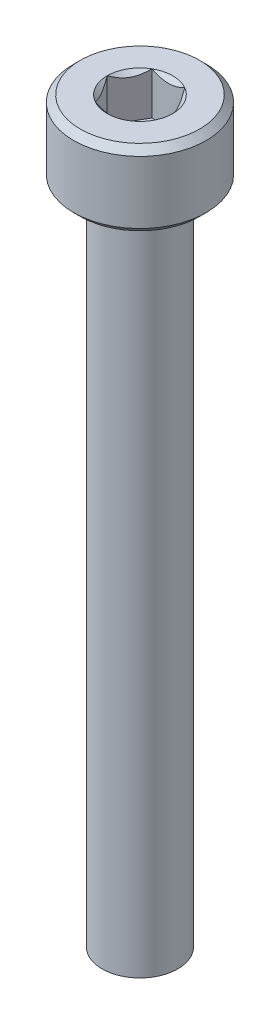
ISO-10303-21;
HEADER;
FILE_DESCRIPTION(('STEP AP214'),'2;1');
FILE_NAME('part.step','',(''),(''),'','','');
FILE_SCHEMA(('AUTOMOTIVE_DESIGN { 1 0 10303 214 1 1 1 1 }'));
ENDSEC;
DATA;
#1=APPLICATION_CONTEXT('core data for automotive mechanical design processes');
#2=APPLICATION_PROTOCOL_DEFINITION('international standard','automotive_design',2000,#1);
#3=PRODUCT_CONTEXT('',#1,'mechanical');
#4=PRODUCT('Part','Part','',(#3));
#5=PRODUCT_RELATED_PRODUCT_CATEGORY('part','',(#4));
#6=PRODUCT_DEFINITION_FORMATION('','',#4);
#7=PRODUCT_DEFINITION_CONTEXT('part definition',#1,'design');
#8=PRODUCT_DEFINITION('design','',#6,#7);
#9=PRODUCT_DEFINITION_SHAPE('','',#8);
#10=(LENGTH_UNIT() NAMED_UNIT(*) SI_UNIT(.MILLI.,.METRE.));
#11=(NAMED_UNIT(*) PLANE_ANGLE_UNIT() SI_UNIT($,.RADIAN.));
#12=(NAMED_UNIT(*) SI_UNIT($,.STERADIAN.) SOLID_ANGLE_UNIT());
#13=UNCERTAINTY_MEASURE_WITH_UNIT(LENGTH_MEASURE(1.E-05),#10,'distance_accuracy_value','');
#14=(GEOMETRIC_REPRESENTATION_CONTEXT(3) GLOBAL_UNCERTAINTY_ASSIGNED_CONTEXT((#13)) GLOBAL_UNIT_ASSIGNED_CONTEXT((#10,
#11,#12)) REPRESENTATION_CONTEXT('',''));
#15=CARTESIAN_POINT('',(0.,0.,0.));
#16=DIRECTION('',(0.,0.,1.));
#17=DIRECTION('',(1.,0.,0.));
#18=AXIS2_PLACEMENT_3D('',#15,#16,#17);
#19=CARTESIAN_POINT('',(0.,4.,0.));
#20=DIRECTION('',(0.,-1.,0.));
#21=DIRECTION('',(0.,0.,-1.));
#22=AXIS2_PLACEMENT_3D('',#19,#20,#21);
#23=CYLINDRICAL_SURFACE('',#22,3.5);
#24=CARTESIAN_POINT('',(0.,0.350000000000001,0.));
#25=DIRECTION('',(0.,1.,0.));
#26=DIRECTION('',(0.,0.,1.));
#27=AXIS2_PLACEMENT_3D('',#24,#25,#26);
#28=CIRCLE('',#27,3.5);
#29=CARTESIAN_POINT('',(0.,0.350000000000001,3.5));
#30=VERTEX_POINT('',#29);
#31=EDGE_CURVE('E227',#30,#30,#28,.T.);
#32=ORIENTED_EDGE('',*,*,#31,.T.);
#33=EDGE_LOOP('',(#32));
#34=FACE_BOUND('',#33,.T.);
#35=CARTESIAN_POINT('',(0.,3.65,0.));
#36=DIRECTION('',(0.,1.,0.));
#37=DIRECTION('',(0.,0.,1.));
#38=AXIS2_PLACEMENT_3D('',#35,#36,#37);
#39=CIRCLE('',#38,3.5);
#40=CARTESIAN_POINT('',(0.,3.65,3.5));
#41=VERTEX_POINT('',#40);
#42=EDGE_CURVE('E104',#41,#41,#39,.F.);
#43=ORIENTED_EDGE('',*,*,#42,.T.);
#44=EDGE_LOOP('',(#43));
#45=FACE_BOUND('',#44,.T.);
#46=ADVANCED_FACE('F32',(#34,#45),#23,.T.);
#47=CARTESIAN_POINT('',(0.,4.,0.));
#48=DIRECTION('',(0.,1.,0.));
#49=DIRECTION('',(0.,0.,1.));
#50=AXIS2_PLACEMENT_3D('',#47,#48,#49);
#51=PLANE('',#50);
#52=CARTESIAN_POINT('',(0.,4.,0.));
#53=DIRECTION('',(0.,1.,0.));
#54=DIRECTION('',(0.,0.,1.));
#55=AXIS2_PLACEMENT_3D('',#52,#53,#54);
#56=CIRCLE('',#55,3.15);
#57=CARTESIAN_POINT('',(0.,4.,3.15));
#58=VERTEX_POINT('',#57);
#59=EDGE_CURVE('E36',#58,#58,#56,.T.);
#60=ORIENTED_EDGE('',*,*,#59,.T.);
#61=EDGE_LOOP('',(#60));
#62=FACE_BOUND('',#61,.T.);
#63=CARTESIAN_POINT('',(0.,4.,0.));
#64=DIRECTION('',(0.,1.,0.));
#65=DIRECTION('',(0.,0.,1.));
#66=AXIS2_PLACEMENT_3D('',#63,#64,#65);
#67=CIRCLE('',#66,1.73205080756888);
#68=CARTESIAN_POINT('',(0.866025403784438,4.,1.5));
#69=VERTEX_POINT('',#68);
#70=CARTESIAN_POINT('',(1.73205080756888,4.,0.));
#71=VERTEX_POINT('',#70);
#72=EDGE_CURVE('E47',#69,#71,#67,.T.);
#73=ORIENTED_EDGE('',*,*,#72,.F.);
#74=CARTESIAN_POINT('',(-0.866025403784438,4.,1.5));
#75=VERTEX_POINT('',#74);
#76=EDGE_CURVE('E54',#75,#69,#67,.T.);
#77=ORIENTED_EDGE('',*,*,#76,.F.);
#78=CARTESIAN_POINT('',(-1.73205080756888,4.,0.));
#79=VERTEX_POINT('',#78);
#80=EDGE_CURVE('E127',#79,#75,#67,.T.);
#81=ORIENTED_EDGE('',*,*,#80,.F.);
#82=CARTESIAN_POINT('',(-0.866025403784439,4.,-1.5));
#83=VERTEX_POINT('',#82);
#84=EDGE_CURVE('E126',#83,#79,#67,.T.);
#85=ORIENTED_EDGE('',*,*,#84,.F.);
#86=CARTESIAN_POINT('',(0.866025403784438,4.,-1.5));
#87=VERTEX_POINT('',#86);
#88=EDGE_CURVE('E94',#87,#83,#67,.T.);
#89=ORIENTED_EDGE('',*,*,#88,.F.);
#90=EDGE_CURVE('E86',#71,#87,#67,.T.);
#91=ORIENTED_EDGE('',*,*,#90,.F.);
#92=EDGE_LOOP('',(#73,#77,#81,#85,#89,#91));
#93=FACE_BOUND('',#92,.T.);
#94=ADVANCED_FACE('F124',(#62,#93),#51,.T.);
#95=CARTESIAN_POINT('',(0.,0.,0.));
#96=DIRECTION('',(0.,1.,0.));
#97=DIRECTION('',(0.,0.,1.));
#98=AXIS2_PLACEMENT_3D('',#95,#96,#97);
#99=PLANE('',#98);
#100=CARTESIAN_POINT('',(0.,0.,0.));
#101=DIRECTION('',(0.,-1.,0.));
#102=DIRECTION('',(0.,0.,-1.));
#103=AXIS2_PLACEMENT_3D('',#100,#101,#102);
#104=CIRCLE('',#103,2.);
#105=CARTESIAN_POINT('',(0.,0.,-2.));
#106=VERTEX_POINT('',#105);
#107=EDGE_CURVE('E11',#106,#106,#104,.T.);
#108=ORIENTED_EDGE('',*,*,#107,.F.);
#109=EDGE_LOOP('',(#108));
#110=FACE_BOUND('',#109,.T.);
#111=CARTESIAN_POINT('',(0.,0.,0.));
#112=DIRECTION('',(0.,1.,0.));
#113=DIRECTION('',(0.,0.,1.));
#114=AXIS2_PLACEMENT_3D('',#111,#112,#113);
#115=CIRCLE('',#114,3.15);
#116=CARTESIAN_POINT('',(0.,0.,3.15));
#117=VERTEX_POINT('',#116);
#118=EDGE_CURVE('E225',#117,#117,#115,.F.);
#119=ORIENTED_EDGE('',*,*,#118,.T.);
#120=EDGE_LOOP('',(#119));
#121=FACE_BOUND('',#120,.T.);
#122=ADVANCED_FACE('F208',(#110,#121),#99,.F.);
#123=CARTESIAN_POINT('',(0.,4.,0.));
#124=DIRECTION('',(0.,1.,0.));
#125=DIRECTION('',(0.,0.,1.));
#126=AXIS2_PLACEMENT_3D('',#123,#124,#125);
#127=CONICAL_SURFACE('',#126,1.73205080756888,0.78539816339745);
#128=ORIENTED_EDGE('',*,*,#88,.T.);
#129=CARTESIAN_POINT('',(-1.72720812969692,4.55557851627079,-1.5));
#130=CARTESIAN_POINT('',(-1.68515175699268,4.52382990785743,-1.5));
#131=CARTESIAN_POINT('',(-1.64286104748673,4.49239259380738,-1.5));
#132=CARTESIAN_POINT('',(-1.55771581035942,4.43026908755641,-1.5));
#133=CARTESIAN_POINT('',(-1.51486114386668,4.3995830858922,-1.5));
#134=CARTESIAN_POINT('',(-1.3846813415127,4.30840719242716,-1.5));
#135=CARTESIAN_POINT('',(-1.29637976071654,4.24928834342677,-1.5));
#136=CARTESIAN_POINT('',(-1.11121478730467,4.1332309963165,-1.5));
#137=CARTESIAN_POINT('',(-1.01415038238167,4.07660955873301,-1.5));
#138=CARTESIAN_POINT('',(-0.815173408897606,3.97303688126565,-1.5));
#139=CARTESIAN_POINT('',(-0.713278669253285,3.92605304154167,-1.5));
#140=CARTESIAN_POINT('',(-0.560333774943112,3.86857266843083,-1.5));
#141=CARTESIAN_POINT('',(-0.511547982948042,3.85207538775725,-1.5));
#142=CARTESIAN_POINT('',(-0.412798620136866,3.822997512927,-1.5));
#143=CARTESIAN_POINT('',(-0.362834968437563,3.81041718859402,-1.5));
#144=CARTESIAN_POINT('',(-0.262863235444982,3.79003619414677,-1.5));
#145=CARTESIAN_POINT('',(-0.212872113808023,3.78215363274598,-1.5));
#146=CARTESIAN_POINT('',(-0.112355243569545,3.771322063969,-1.5));
#147=CARTESIAN_POINT('',(-0.0618295883726279,3.76837220852435,-1.5));
#148=CARTESIAN_POINT('',(0.037429173332384,3.76762485772485,-1.5));
#149=CARTESIAN_POINT('',(0.0861609672002989,3.76964473355808,-1.5));
#150=CARTESIAN_POINT('',(0.183206937768827,3.77832255289676,-1.5));
#151=CARTESIAN_POINT('',(0.231521073438269,3.78498094696846,-1.5));
#152=CARTESIAN_POINT('',(0.328199853425436,3.80268524412257,-1.5));
#153=CARTESIAN_POINT('',(0.376550616310328,3.81380581125704,-1.5));
#154=CARTESIAN_POINT('',(0.472195697125598,3.83984341404871,-1.5));
#155=CARTESIAN_POINT('',(0.51949010309274,3.85476013204094,-1.5));
#156=CARTESIAN_POINT('',(0.668391282696624,3.90733522359607,-1.5));
#157=CARTESIAN_POINT('',(0.767878709508552,3.95098128747198,-1.5));
#158=CARTESIAN_POINT('',(0.962179866690724,4.0480229945931,-1.5));
#159=CARTESIAN_POINT('',(1.05697519961444,4.10145366508953,-1.5));
#160=CARTESIAN_POINT('',(1.23814273533383,4.21168585200456,-1.5));
#161=CARTESIAN_POINT('',(1.3246994218129,4.2681879206986,-1.5));
#162=CARTESIAN_POINT('',(1.45222331290673,4.35553430157866,-1.5));
#163=CARTESIAN_POINT('',(1.49418091978756,4.38495775868004,-1.5));
#164=CARTESIAN_POINT('',(1.57752272931476,4.44458282183046,-1.5));
#165=CARTESIAN_POINT('',(1.61890708647354,4.47478421166444,-1.5));
#166=CARTESIAN_POINT('',(1.66005278019494,4.50530817860946,-1.5));
#167=B_SPLINE_CURVE_WITH_KNOTS('',3,(#129,#130,#131,#132,#133,#134,#135,#136,#137,#138,#139,
#140,#141,#142,#143,#144,#145,#146,#147,#148,#149,#150,#151,#152,#153,#154,#155,#156,#157,#158,
#159,#160,#161,#162,#163,#164,#165,#166),.UNSPECIFIED.,.F.,.F.,(4,2,2,2,2,2,2,2,2,2,2,2,2,2,2,2,
2,2,4),(0.,0.158079548982669,0.316198780993942,0.634850417346958,0.971690311361509,
1.30737131660667,1.46173961127089,1.61611853740677,1.76772101421409,1.91929742368538,
2.065387412096,2.21149159305544,2.36014984633872,2.50879566386709,2.83376031422673,
3.15991186985652,3.46985601802197,3.62358896039974,3.7772796264207),.UNSPECIFIED.);
#168=EDGE_CURVE('E99',#87,#83,#167,.F.);
#169=ORIENTED_EDGE('',*,*,#168,.F.);
#170=EDGE_LOOP('',(#128,#169));
#171=FACE_BOUND('',#170,.T.);
#172=ADVANCED_FACE('F100',(#171),#127,.F.);
#173=ORIENTED_EDGE('',*,*,#84,.T.);
#174=CARTESIAN_POINT('',(-0.865909933730601,4.00011548160007,-1.5002));
#175=CARTESIAN_POINT('',(-0.895682611594166,3.97036547606733,-1.44863220926292));
#176=CARTESIAN_POINT('',(-0.925953159489765,3.94236248391031,-1.3962020823348));
#177=CARTESIAN_POINT('',(-0.987678321317123,3.89108923044014,-1.2892909659444));
#178=CARTESIAN_POINT('',(-1.01913880822717,3.86784750504437,-1.23479980418534));
#179=CARTESIAN_POINT('',(-1.08257741237344,3.82803372899222,-1.12492091864275));
#180=CARTESIAN_POINT('',(-1.11453936608521,3.8113615856709,-1.0695611909048));
#181=CARTESIAN_POINT('',(-1.1791670593912,3.7856744568181,-0.957622742522849));
#182=CARTESIAN_POINT('',(-1.21183082354213,3.77664029047887,-0.901047443446992));
#183=CARTESIAN_POINT('',(-1.26812411040032,3.76848908122685,-0.803544610483559));
#184=CARTESIAN_POINT('',(-1.29168087824208,3.76728225298922,-0.762743091719534));
#185=CARTESIAN_POINT('',(-1.33875285845138,3.76931405716227,-0.681212030384142));
#186=CARTESIAN_POINT('',(-1.36226806050018,3.77255367074831,-0.64048250568537));
#187=CARTESIAN_POINT('',(-1.40907206156905,3.78329198598196,-0.559415597836584));
#188=CARTESIAN_POINT('',(-1.43236062923612,3.79079465301873,-0.519078615401712));
#189=CARTESIAN_POINT('',(-1.47854689118996,3.80965161192829,-0.439081663085969));
#190=CARTESIAN_POINT('',(-1.50144441326545,3.82100755701858,-0.399421991483792));
#191=CARTESIAN_POINT('',(-1.56009461325633,3.85472164759267,-0.297836865225515));
#192=CARTESIAN_POINT('',(-1.59548353987866,3.87962184909337,-0.236541446290311));
#193=CARTESIAN_POINT('',(-1.64751843074894,3.92165665327158,-0.146414371536686));
#194=CARTESIAN_POINT('',(-1.66466545167617,3.9364251535591,-0.116714860092282));
#195=CARTESIAN_POINT('',(-1.69864410935691,3.96731056594017,-0.0578620986162487));
#196=CARTESIAN_POINT('',(-1.71547589206761,3.98342683412171,-0.0287085957793624));
#197=CARTESIAN_POINT('',(-1.73216627762272,4.00011548160007,0.00020000000000028));
#198=B_SPLINE_CURVE_WITH_KNOTS('',3,(#174,#175,#176,#177,#178,#179,#180,#181,#182,#183,#184,
#185,#186,#187,#188,#189,#190,#191,#192,#193,#194,#195,#196,#197),.UNSPECIFIED.,.F.,.F.,(4,2,2,
2,2,2,2,2,2,2,2,4),(0.,0.199829143693304,0.400822987382388,0.598623720538181,0.795926240188889,
0.937113067959881,1.07833105577193,1.21968061668222,1.36109089931054,1.58570969637565,
1.69770705470964,1.80965120737194),.UNSPECIFIED.);
#199=EDGE_CURVE('E129',#83,#79,#198,.T.);
#200=ORIENTED_EDGE('',*,*,#199,.F.);
#201=EDGE_LOOP('',(#173,#200));
#202=FACE_BOUND('',#201,.T.);
#203=ADVANCED_FACE('F240',(#202),#127,.F.);
#204=ORIENTED_EDGE('',*,*,#80,.T.);
#205=CARTESIAN_POINT('',(-1.73216627762272,4.00011548160007,-0.000199999999999694));
#206=CARTESIAN_POINT('',(-1.70239359975915,3.97036547606733,0.051367790737076));
#207=CARTESIAN_POINT('',(-1.67212305186355,3.94236248391031,0.103797917665201));
#208=CARTESIAN_POINT('',(-1.61039789003619,3.89108923044014,0.210709034055597));
#209=CARTESIAN_POINT('',(-1.57893740312614,3.86784750504437,0.265200195814662));
#210=CARTESIAN_POINT('',(-1.51549879897987,3.82803372899222,0.375079081357249));
#211=CARTESIAN_POINT('',(-1.4835368452681,3.8113615856709,0.4304388090952));
#212=CARTESIAN_POINT('',(-1.41890915196211,3.7856744568181,0.542377257477151));
#213=CARTESIAN_POINT('',(-1.38624538781118,3.77664029047887,0.598952556553009));
#214=CARTESIAN_POINT('',(-1.32995210095299,3.76848908122685,0.696455389516441));
#215=CARTESIAN_POINT('',(-1.30639533311124,3.76728225298922,0.737256908280466));
#216=CARTESIAN_POINT('',(-1.25932335290193,3.76931405716227,0.818787969615858));
#217=CARTESIAN_POINT('',(-1.23580815085313,3.77255367074831,0.85951749431463));
#218=CARTESIAN_POINT('',(-1.18900414978427,3.78329198598196,0.940584402163416));
#219=CARTESIAN_POINT('',(-1.1657155821172,3.79079465301873,0.980921384598288));
#220=CARTESIAN_POINT('',(-1.11952932016335,3.80965161192829,1.06091833691403));
#221=CARTESIAN_POINT('',(-1.09663179808786,3.82100755701859,1.10057800851621));
#222=CARTESIAN_POINT('',(-1.03798159809698,3.85472164759267,1.20216313477448));
#223=CARTESIAN_POINT('',(-1.00259267147465,3.87962184909337,1.26345855370969));
#224=CARTESIAN_POINT('',(-0.950557780604375,3.92165665327158,1.35358562846331));
#225=CARTESIAN_POINT('',(-0.933410759677147,3.9364251535591,1.38328513990772));
#226=CARTESIAN_POINT('',(-0.899432101996407,3.96731056594017,1.44213790138375));
#227=CARTESIAN_POINT('',(-0.88260031928571,3.98342683412171,1.47129140422064));
#228=CARTESIAN_POINT('',(-0.865909933730601,4.00011548160007,1.5002));
#229=B_SPLINE_CURVE_WITH_KNOTS('',3,(#205,#206,#207,#208,#209,#210,#211,#212,#213,#214,#215,
#216,#217,#218,#219,#220,#221,#222,#223,#224,#225,#226,#227,#228),.UNSPECIFIED.,.F.,.F.,(4,2,2,
2,2,2,2,2,2,2,2,4),(0.,0.199829143693305,0.400822987382389,0.598623720538181,0.795926240188889,
0.937113067959881,1.07833105577193,1.21968061668222,1.36109089931054,1.58570969637565,
1.69770705470964,1.80965120737194),.UNSPECIFIED.);
#230=EDGE_CURVE('E139',#79,#75,#229,.T.);
#231=ORIENTED_EDGE('',*,*,#230,.F.);
#232=EDGE_LOOP('',(#204,#231));
#233=FACE_BOUND('',#232,.T.);
#234=ADVANCED_FACE('F256',(#233),#127,.F.);
#235=ORIENTED_EDGE('',*,*,#76,.T.);
#236=CARTESIAN_POINT('',(-1.72720812994822,4.55557851646053,1.5));
#237=CARTESIAN_POINT('',(-1.68515175723693,4.52382990803985,1.5));
#238=CARTESIAN_POINT('',(-1.64286104772391,4.49239259398251,1.5));
#239=CARTESIAN_POINT('',(-1.55771581058238,4.43026908771699,1.5));
#240=CARTESIAN_POINT('',(-1.51486114408249,4.39958308604553,1.5));
#241=CARTESIAN_POINT('',(-1.38468134170665,4.30840719255859,1.5));
#242=CARTESIAN_POINT('',(-1.29637976089561,4.24928834354366,1.5));
#243=CARTESIAN_POINT('',(-1.11121478745132,4.13323099640349,1.5));
#244=CARTESIAN_POINT('',(-1.01415038251067,4.07660955880473,1.5));
#245=CARTESIAN_POINT('',(-0.815173408989814,3.9730368813091,1.5));
#246=CARTESIAN_POINT('',(-0.71327866932636,3.92605304157206,1.5));
#247=CARTESIAN_POINT('',(-0.56033377500179,3.86857266845154,1.5));
#248=CARTESIAN_POINT('',(-0.511547983012749,3.85207538777834,1.5));
#249=CARTESIAN_POINT('',(-0.412798620213828,3.82299751294763,1.5));
#250=CARTESIAN_POINT('',(-0.362834968520751,3.8104171886138,1.5));
#251=CARTESIAN_POINT('',(-0.262863235540417,3.79003619416346,1.5));
#252=CARTESIAN_POINT('',(-0.212872113909475,3.78215363276045,1.5));
#253=CARTESIAN_POINT('',(-0.112355243682832,3.77132206397768,1.5));
#254=CARTESIAN_POINT('',(-0.061829588491731,3.76837220852945,1.5));
#255=CARTESIAN_POINT('',(0.0374291732025493,3.76762485772178,1.5));
#256=CARTESIAN_POINT('',(0.086160967065534,3.76964473355048,1.5));
#257=CARTESIAN_POINT('',(0.183206937624695,3.77832255287941,1.5));
#258=CARTESIAN_POINT('',(0.2315210732897,3.78498094694588,1.5));
#259=CARTESIAN_POINT('',(0.328199853268108,3.80268524408904,1.5));
#260=CARTESIAN_POINT('',(0.376550616148692,3.81380581121775,1.5));
#261=CARTESIAN_POINT('',(0.47219569695576,3.83984341399777,1.5));
#262=CARTESIAN_POINT('',(0.51949010291901,3.8547601319841,1.5));
#263=CARTESIAN_POINT('',(0.668391282485064,3.90733522351148,1.5));
#264=CARTESIAN_POINT('',(0.767878709264951,3.95098128736184,1.5));
#265=CARTESIAN_POINT('',(0.9621798663855,4.04802299442906,1.5));
#266=CARTESIAN_POINT('',(1.05697519927965,4.10145366489712,1.5));
#267=CARTESIAN_POINT('',(1.23814273494588,4.21168585175783,1.5));
#268=CARTESIAN_POINT('',(1.32469942140117,4.26818792042618,1.5));
#269=CARTESIAN_POINT('',(1.45222331245985,4.35553430126784,1.5));
#270=CARTESIAN_POINT('',(1.49418091932912,4.38495775835653,1.5));
#271=CARTESIAN_POINT('',(1.5775227288333,4.44458282148157,1.5));
#272=CARTESIAN_POINT('',(1.6189070859806,4.47478421130286,1.5));
#273=CARTESIAN_POINT('',(1.66005277969054,4.50530817823521,1.5));
#274=B_SPLINE_CURVE_WITH_KNOTS('',3,(#236,#237,#238,#239,#240,#241,#242,#243,#244,#245,#246,
#247,#248,#249,#250,#251,#252,#253,#254,#255,#256,#257,#258,#259,#260,#261,#262,#263,#264,#265,
#266,#267,#268,#269,#270,#271,#272,#273),.UNSPECIFIED.,.F.,.F.,(4,2,2,2,2,2,2,2,2,2,2,2,2,2,2,2,
2,2,4),(0.,0.158079549012757,0.316198781054129,0.634850417468465,0.971690311551782,
1.30737131686505,1.46173961151184,1.61611853763032,1.76772101442095,1.91929742387554,
2.06538741227089,2.21149159321503,2.36014984648185,2.50879566399376,2.83376031423511,
3.15991186974582,3.4698560178094,3.62358896013692,3.77727962610764),.UNSPECIFIED.);
#275=EDGE_CURVE('E168',#75,#69,#274,.T.);
#276=ORIENTED_EDGE('',*,*,#275,.F.);
#277=EDGE_LOOP('',(#235,#276));
#278=FACE_BOUND('',#277,.T.);
#279=ADVANCED_FACE('F286',(#278),#127,.F.);
#280=ORIENTED_EDGE('',*,*,#72,.T.);
#281=CARTESIAN_POINT('',(0.865909933730601,4.00011548160007,1.5002));
#282=CARTESIAN_POINT('',(0.895682611594166,3.97036547606733,1.44863220926292));
#283=CARTESIAN_POINT('',(0.925953159489765,3.94236248391031,1.3962020823348));
#284=CARTESIAN_POINT('',(0.987678321317124,3.89108923044014,1.2892909659444));
#285=CARTESIAN_POINT('',(1.01913880822717,3.86784750504437,1.23479980418534));
#286=CARTESIAN_POINT('',(1.08257741237344,3.82803372899222,1.12492091864275));
#287=CARTESIAN_POINT('',(1.11453936608521,3.8113615856709,1.0695611909048));
#288=CARTESIAN_POINT('',(1.1791670593912,3.7856744568181,0.95762274252285));
#289=CARTESIAN_POINT('',(1.21183082354213,3.77664029047887,0.901047443446992));
#290=CARTESIAN_POINT('',(1.26812411040032,3.76848908122685,0.80354461048356));
#291=CARTESIAN_POINT('',(1.29168087824208,3.76728225298922,0.762743091719534));
#292=CARTESIAN_POINT('',(1.33875285845138,3.76931405716227,0.681212030384142));
#293=CARTESIAN_POINT('',(1.36226806050018,3.77255367074831,0.640482505685371));
#294=CARTESIAN_POINT('',(1.40907206156905,3.78329198598196,0.559415597836584));
#295=CARTESIAN_POINT('',(1.43236062923612,3.79079465301873,0.519078615401712));
#296=CARTESIAN_POINT('',(1.47854689118996,3.80965161192829,0.43908166308597));
#297=CARTESIAN_POINT('',(1.50144441326545,3.82100755701859,0.399421991483792));
#298=CARTESIAN_POINT('',(1.56009461325633,3.85472164759267,0.297836865225515));
#299=CARTESIAN_POINT('',(1.59548353987866,3.87962184909337,0.236541446290311));
#300=CARTESIAN_POINT('',(1.64751843074894,3.92165665327158,0.146414371536686));
#301=CARTESIAN_POINT('',(1.66466545167617,3.9364251535591,0.116714860092282));
#302=CARTESIAN_POINT('',(1.69864410935691,3.96731056594017,0.0578620986162488));
#303=CARTESIAN_POINT('',(1.71547589206761,3.98342683412171,0.0287085957793626));
#304=CARTESIAN_POINT('',(1.73216627762272,4.00011548160007,-0.000200000000000026));
#305=B_SPLINE_CURVE_WITH_KNOTS('',3,(#281,#282,#283,#284,#285,#286,#287,#288,#289,#290,#291,
#292,#293,#294,#295,#296,#297,#298,#299,#300,#301,#302,#303,#304),.UNSPECIFIED.,.F.,.F.,(4,2,2,
2,2,2,2,2,2,2,2,4),(0.,0.199829143693305,0.400822987382389,0.59862372053818,0.795926240188889,
0.937113067959881,1.07833105577193,1.21968061668222,1.36109089931054,1.58570969637565,
1.69770705470964,1.80965120737194),.UNSPECIFIED.);
#306=EDGE_CURVE('E114',#69,#71,#305,.T.);
#307=ORIENTED_EDGE('',*,*,#306,.F.);
#308=EDGE_LOOP('',(#280,#307));
#309=FACE_BOUND('',#308,.T.);
#310=ADVANCED_FACE('F154',(#309),#127,.F.);
#311=ORIENTED_EDGE('',*,*,#90,.T.);
#312=CARTESIAN_POINT('',(1.73216627762272,4.00011548160007,0.000200000000000282));
#313=CARTESIAN_POINT('',(1.70239359975915,3.97036547606733,-0.0513677907370753));
#314=CARTESIAN_POINT('',(1.67212305186355,3.94236248391031,-0.103797917665201));
#315=CARTESIAN_POINT('',(1.61039789003619,3.89108923044014,-0.210709034055596));
#316=CARTESIAN_POINT('',(1.57893740312614,3.86784750504437,-0.265200195814661));
#317=CARTESIAN_POINT('',(1.51549879897987,3.82803372899222,-0.375079081357248));
#318=CARTESIAN_POINT('',(1.4835368452681,3.8113615856709,-0.430438809095199));
#319=CARTESIAN_POINT('',(1.41890915196211,3.7856744568181,-0.54237725747715));
#320=CARTESIAN_POINT('',(1.38624538781118,3.77664029047887,-0.598952556553008));
#321=CARTESIAN_POINT('',(1.32995210095299,3.76848908122685,-0.69645538951644));
#322=CARTESIAN_POINT('',(1.30639533311124,3.76728225298922,-0.737256908280466));
#323=CARTESIAN_POINT('',(1.25932335290193,3.76931405716227,-0.818787969615858));
#324=CARTESIAN_POINT('',(1.23580815085313,3.77255367074831,-0.85951749431463));
#325=CARTESIAN_POINT('',(1.18900414978427,3.78329198598196,-0.940584402163416));
#326=CARTESIAN_POINT('',(1.1657155821172,3.79079465301873,-0.980921384598288));
#327=CARTESIAN_POINT('',(1.11952932016335,3.80965161192829,-1.06091833691403));
#328=CARTESIAN_POINT('',(1.09663179808786,3.82100755701858,-1.10057800851621));
#329=CARTESIAN_POINT('',(1.03798159809698,3.85472164759267,-1.20216313477448));
#330=CARTESIAN_POINT('',(1.00259267147465,3.87962184909337,-1.26345855370969));
#331=CARTESIAN_POINT('',(0.950557780604375,3.92165665327158,-1.35358562846331));
#332=CARTESIAN_POINT('',(0.933410759677148,3.9364251535591,-1.38328513990772));
#333=CARTESIAN_POINT('',(0.899432101996407,3.96731056594017,-1.44213790138375));
#334=CARTESIAN_POINT('',(0.88260031928571,3.98342683412171,-1.47129140422064));
#335=CARTESIAN_POINT('',(0.865909933730601,4.00011548160007,-1.5002));
#336=B_SPLINE_CURVE_WITH_KNOTS('',3,(#312,#313,#314,#315,#316,#317,#318,#319,#320,#321,#322,
#323,#324,#325,#326,#327,#328,#329,#330,#331,#332,#333,#334,#335),.UNSPECIFIED.,.F.,.F.,(4,2,2,
2,2,2,2,2,2,2,2,4),(0.,0.199829143693305,0.400822987382389,0.598623720538181,0.79592624018889,
0.937113067959881,1.07833105577193,1.21968061668222,1.36109089931054,1.58570969637566,
1.69770705470964,1.80965120737194),.UNSPECIFIED.);
#337=EDGE_CURVE('E90',#71,#87,#336,.T.);
#338=ORIENTED_EDGE('',*,*,#337,.F.);
#339=EDGE_LOOP('',(#311,#338));
#340=FACE_BOUND('',#339,.T.);
#341=ADVANCED_FACE('F88',(#340),#127,.F.);
#342=CARTESIAN_POINT('',(0.,1.75,0.));
#343=DIRECTION('',(0.,1.,0.));
#344=DIRECTION('',(0.,0.,1.));
#345=AXIS2_PLACEMENT_3D('',#342,#343,#344);
#346=PLANE('',#345);
#347=DIRECTION('',(-0.5,0.,-0.866025403784439));
#348=VECTOR('',#347,1.);
#349=CARTESIAN_POINT('',(1.73205080756888,1.75,0.));
#350=LINE('',#349,#348);
#351=CARTESIAN_POINT('',(1.73205080756888,1.75,0.));
#352=VERTEX_POINT('',#351);
#353=CARTESIAN_POINT('',(0.866025403784438,1.75,-1.5));
#354=VERTEX_POINT('',#353);
#355=EDGE_CURVE('E113',#352,#354,#350,.T.);
#356=ORIENTED_EDGE('',*,*,#355,.T.);
#357=DIRECTION('',(-1.,0.,0.));
#358=VECTOR('',#357,1.);
#359=CARTESIAN_POINT('',(0.866025403784438,1.75,-1.5));
#360=LINE('',#359,#358);
#361=CARTESIAN_POINT('',(-0.866025403784439,1.75,-1.5));
#362=VERTEX_POINT('',#361);
#363=EDGE_CURVE('E118',#354,#362,#360,.T.);
#364=ORIENTED_EDGE('',*,*,#363,.T.);
#365=DIRECTION('',(-0.5,0.,0.866025403784439));
#366=VECTOR('',#365,1.);
#367=CARTESIAN_POINT('',(-0.866025403784439,1.75,-1.5));
#368=LINE('',#367,#366);
#369=CARTESIAN_POINT('',(-1.73205080756888,1.75,0.));
#370=VERTEX_POINT('',#369);
#371=EDGE_CURVE('E280',#362,#370,#368,.T.);
#372=ORIENTED_EDGE('',*,*,#371,.T.);
#373=DIRECTION('',(0.5,0.,0.866025403784439));
#374=VECTOR('',#373,1.);
#375=CARTESIAN_POINT('',(-1.73205080756888,1.75,0.));
#376=LINE('',#375,#374);
#377=CARTESIAN_POINT('',(-0.866025403784438,1.75,1.5));
#378=VERTEX_POINT('',#377);
#379=EDGE_CURVE('E263',#370,#378,#376,.T.);
#380=ORIENTED_EDGE('',*,*,#379,.T.);
#381=DIRECTION('',(1.,0.,0.));
#382=VECTOR('',#381,1.);
#383=CARTESIAN_POINT('',(-0.866025403784438,1.75,1.5));
#384=LINE('',#383,#382);
#385=CARTESIAN_POINT('',(0.866025403784439,1.75,1.5));
#386=VERTEX_POINT('',#385);
#387=EDGE_CURVE('E276',#378,#386,#384,.T.);
#388=ORIENTED_EDGE('',*,*,#387,.T.);
#389=DIRECTION('',(0.5,0.,-0.866025403784439));
#390=VECTOR('',#389,1.);
#391=CARTESIAN_POINT('',(0.866025403784439,1.75,1.5));
#392=LINE('',#391,#390);
#393=EDGE_CURVE('E121',#386,#352,#392,.T.);
#394=ORIENTED_EDGE('',*,*,#393,.T.);
#395=EDGE_LOOP('',(#356,#364,#372,#380,#388,#394));
#396=FACE_BOUND('',#395,.T.);
#397=ADVANCED_FACE('F153',(#396),#346,.T.);
#398=CARTESIAN_POINT('',(0.866025403784438,1.75,-1.5));
#399=DIRECTION('',(0.,0.,-1.));
#400=DIRECTION('',(-1.,0.,0.));
#401=AXIS2_PLACEMENT_3D('',#398,#399,#400);
#402=PLANE('',#401);
#403=DIRECTION('',(0.,1.,0.));
#404=VECTOR('',#403,1.);
#405=CARTESIAN_POINT('',(0.866025403784438,1.75,-1.5));
#406=LINE('',#405,#404);
#407=EDGE_CURVE('E111',#354,#87,#406,.T.);
#408=ORIENTED_EDGE('',*,*,#407,.T.);
#409=ORIENTED_EDGE('',*,*,#168,.T.);
#410=DIRECTION('',(0.,1.,0.));
#411=VECTOR('',#410,1.);
#412=CARTESIAN_POINT('',(-0.866025403784439,1.75,-1.5));
#413=LINE('',#412,#411);
#414=EDGE_CURVE('E120',#362,#83,#413,.T.);
#415=ORIENTED_EDGE('',*,*,#414,.F.);
#416=ORIENTED_EDGE('',*,*,#363,.F.);
#417=EDGE_LOOP('',(#408,#409,#415,#416));
#418=FACE_BOUND('',#417,.T.);
#419=ADVANCED_FACE('F116',(#418),#402,.F.);
#420=CARTESIAN_POINT('',(-0.866025403784439,1.75,-1.5));
#421=DIRECTION('',(-0.866025403784439,0.,-0.5));
#422=DIRECTION('',(-0.5,0.,0.866025403784439));
#423=AXIS2_PLACEMENT_3D('',#420,#421,#422);
#424=PLANE('',#423);
#425=ORIENTED_EDGE('',*,*,#414,.T.);
#426=ORIENTED_EDGE('',*,*,#199,.T.);
#427=DIRECTION('',(0.,1.,0.));
#428=VECTOR('',#427,1.);
#429=CARTESIAN_POINT('',(-1.73205080756888,1.75,0.));
#430=LINE('',#429,#428);
#431=EDGE_CURVE('E259',#370,#79,#430,.T.);
#432=ORIENTED_EDGE('',*,*,#431,.F.);
#433=ORIENTED_EDGE('',*,*,#371,.F.);
#434=EDGE_LOOP('',(#425,#426,#432,#433));
#435=FACE_BOUND('',#434,.T.);
#436=ADVANCED_FACE('F146',(#435),#424,.F.);
#437=CARTESIAN_POINT('',(-1.73205080756888,1.75,0.));
#438=DIRECTION('',(-0.866025403784439,0.,0.5));
#439=DIRECTION('',(0.5,0.,0.866025403784439));
#440=AXIS2_PLACEMENT_3D('',#437,#438,#439);
#441=PLANE('',#440);
#442=ORIENTED_EDGE('',*,*,#431,.T.);
#443=ORIENTED_EDGE('',*,*,#230,.T.);
#444=DIRECTION('',(0.,1.,0.));
#445=VECTOR('',#444,1.);
#446=CARTESIAN_POINT('',(-0.866025403784438,1.75,1.5));
#447=LINE('',#446,#445);
#448=EDGE_CURVE('E265',#378,#75,#447,.T.);
#449=ORIENTED_EDGE('',*,*,#448,.F.);
#450=ORIENTED_EDGE('',*,*,#379,.F.);
#451=EDGE_LOOP('',(#442,#443,#449,#450));
#452=FACE_BOUND('',#451,.T.);
#453=ADVANCED_FACE('F192',(#452),#441,.F.);
#454=CARTESIAN_POINT('',(-0.866025403784438,1.75,1.5));
#455=DIRECTION('',(0.,0.,1.));
#456=DIRECTION('',(1.,0.,0.));
#457=AXIS2_PLACEMENT_3D('',#454,#455,#456);
#458=PLANE('',#457);
#459=ORIENTED_EDGE('',*,*,#448,.T.);
#460=ORIENTED_EDGE('',*,*,#275,.T.);
#461=DIRECTION('',(0.,1.,0.));
#462=VECTOR('',#461,1.);
#463=CARTESIAN_POINT('',(0.866025403784439,1.75,1.5));
#464=LINE('',#463,#462);
#465=EDGE_CURVE('E267',#386,#69,#464,.T.);
#466=ORIENTED_EDGE('',*,*,#465,.F.);
#467=ORIENTED_EDGE('',*,*,#387,.F.);
#468=EDGE_LOOP('',(#459,#460,#466,#467));
#469=FACE_BOUND('',#468,.T.);
#470=ADVANCED_FACE('F188',(#469),#458,.F.);
#471=CARTESIAN_POINT('',(0.866025403784439,1.75,1.5));
#472=DIRECTION('',(0.866025403784439,0.,0.5));
#473=DIRECTION('',(0.5,0.,-0.866025403784439));
#474=AXIS2_PLACEMENT_3D('',#471,#472,#473);
#475=PLANE('',#474);
#476=ORIENTED_EDGE('',*,*,#465,.T.);
#477=ORIENTED_EDGE('',*,*,#306,.T.);
#478=DIRECTION('',(0.,1.,0.));
#479=VECTOR('',#478,1.);
#480=CARTESIAN_POINT('',(1.73205080756888,1.75,0.));
#481=LINE('',#480,#479);
#482=EDGE_CURVE('E105',#352,#71,#481,.T.);
#483=ORIENTED_EDGE('',*,*,#482,.F.);
#484=ORIENTED_EDGE('',*,*,#393,.F.);
#485=EDGE_LOOP('',(#476,#477,#483,#484));
#486=FACE_BOUND('',#485,.T.);
#487=ADVANCED_FACE('F185',(#486),#475,.F.);
#488=CARTESIAN_POINT('',(1.73205080756888,1.75,0.));
#489=DIRECTION('',(0.866025403784439,0.,-0.5));
#490=DIRECTION('',(-0.5,0.,-0.866025403784439));
#491=AXIS2_PLACEMENT_3D('',#488,#489,#490);
#492=PLANE('',#491);
#493=ORIENTED_EDGE('',*,*,#482,.T.);
#494=ORIENTED_EDGE('',*,*,#337,.T.);
#495=ORIENTED_EDGE('',*,*,#407,.F.);
#496=ORIENTED_EDGE('',*,*,#355,.F.);
#497=EDGE_LOOP('',(#493,#494,#495,#496));
#498=FACE_BOUND('',#497,.T.);
#499=ADVANCED_FACE('F109',(#498),#492,.F.);
#500=CARTESIAN_POINT('',(0.,0.350000000000001,0.));
#501=DIRECTION('',(0.,1.,0.));
#502=DIRECTION('',(0.,0.,1.));
#503=AXIS2_PLACEMENT_3D('',#500,#501,#502);
#504=CONICAL_SURFACE('',#503,3.5,0.78539816339745);
#505=ORIENTED_EDGE('',*,*,#118,.F.);
#506=EDGE_LOOP('',(#505));
#507=FACE_BOUND('',#506,.T.);
#508=ORIENTED_EDGE('',*,*,#31,.F.);
#509=EDGE_LOOP('',(#508));
#510=FACE_BOUND('',#509,.T.);
#511=ADVANCED_FACE('F214',(#507,#510),#504,.T.);
#512=CARTESIAN_POINT('',(0.,4.,0.));
#513=DIRECTION('',(0.,-1.,0.));
#514=DIRECTION('',(0.,0.,-1.));
#515=AXIS2_PLACEMENT_3D('',#512,#513,#514);
#516=CONICAL_SURFACE('',#515,3.15,0.785398163397448);
#517=ORIENTED_EDGE('',*,*,#42,.F.);
#518=EDGE_LOOP('',(#517));
#519=FACE_BOUND('',#518,.T.);
#520=ORIENTED_EDGE('',*,*,#59,.F.);
#521=EDGE_LOOP('',(#520));
#522=FACE_BOUND('',#521,.T.);
#523=ADVANCED_FACE('F34',(#519,#522),#516,.T.);
#524=CARTESIAN_POINT('',(0.,-35.,0.));
#525=DIRECTION('',(0.,1.,0.));
#526=DIRECTION('',(0.,0.,1.));
#527=AXIS2_PLACEMENT_3D('',#524,#525,#526);
#528=CYLINDRICAL_SURFACE('',#527,2.);
#529=CARTESIAN_POINT('',(0.,-35.,0.));
#530=DIRECTION('',(0.,-1.,0.));
#531=DIRECTION('',(0.,0.,-1.));
#532=AXIS2_PLACEMENT_3D('',#529,#530,#531);
#533=CIRCLE('',#532,2.);
#534=CARTESIAN_POINT('',(0.,-35.,-2.));
#535=VERTEX_POINT('',#534);
#536=EDGE_CURVE('E252',#535,#535,#533,.T.);
#537=ORIENTED_EDGE('',*,*,#536,.F.);
#538=EDGE_LOOP('',(#537));
#539=FACE_BOUND('',#538,.T.);
#540=ORIENTED_EDGE('',*,*,#107,.T.);
#541=EDGE_LOOP('',(#540));
#542=FACE_BOUND('',#541,.T.);
#543=ADVANCED_FACE('F155',(#539,#542),#528,.T.);
#544=CARTESIAN_POINT('',(0.,-35.,0.));
#545=DIRECTION('',(0.,-1.,0.));
#546=DIRECTION('',(0.,0.,-1.));
#547=AXIS2_PLACEMENT_3D('',#544,#545,#546);
#548=PLANE('',#547);
#549=ORIENTED_EDGE('',*,*,#536,.T.);
#550=EDGE_LOOP('',(#549));
#551=FACE_BOUND('',#550,.T.);
#552=ADVANCED_FACE('F244',(#551),#548,.T.);
#553=CLOSED_SHELL('',(#46,#94,#122,#172,#203,#234,#279,#310,#341,#397,#419,#436,#453,#470,#487,
#499,#511,#523,#543,#552));
#554=MANIFOLD_SOLID_BREP('B2',#553);
#555=ADVANCED_BREP_SHAPE_REPRESENTATION('',(#18,#554),#14);
#556=SHAPE_DEFINITION_REPRESENTATION(#9,#555);
ENDSEC;
END-ISO-10303-21;
